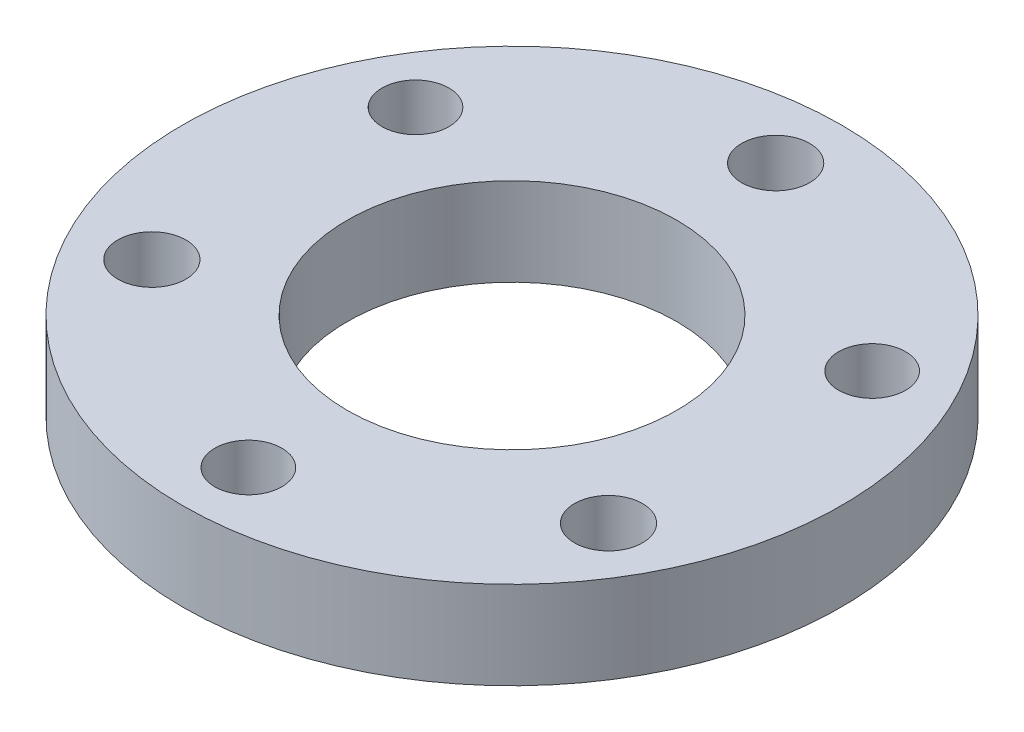
ISO-10303-21;
HEADER;
FILE_DESCRIPTION(('STEP AP214'),'2;1');
FILE_NAME('part.step','',(''),(''),'','','');
FILE_SCHEMA(('AUTOMOTIVE_DESIGN { 1 0 10303 214 1 1 1 1 }'));
ENDSEC;
DATA;
#1=APPLICATION_CONTEXT('core data for automotive mechanical design processes');
#2=APPLICATION_PROTOCOL_DEFINITION('international standard','automotive_design',2000,#1);
#3=PRODUCT_CONTEXT('',#1,'mechanical');
#4=PRODUCT('Part','Part','',(#3));
#5=PRODUCT_RELATED_PRODUCT_CATEGORY('part','',(#4));
#6=PRODUCT_DEFINITION_FORMATION('','',#4);
#7=PRODUCT_DEFINITION_CONTEXT('part definition',#1,'design');
#8=PRODUCT_DEFINITION('design','',#6,#7);
#9=PRODUCT_DEFINITION_SHAPE('','',#8);
#10=(LENGTH_UNIT() NAMED_UNIT(*) SI_UNIT(.MILLI.,.METRE.));
#11=(NAMED_UNIT(*) PLANE_ANGLE_UNIT() SI_UNIT($,.RADIAN.));
#12=(NAMED_UNIT(*) SI_UNIT($,.STERADIAN.) SOLID_ANGLE_UNIT());
#13=UNCERTAINTY_MEASURE_WITH_UNIT(LENGTH_MEASURE(1.E-05),#10,'distance_accuracy_value','');
#14=(GEOMETRIC_REPRESENTATION_CONTEXT(3) GLOBAL_UNCERTAINTY_ASSIGNED_CONTEXT((#13)) GLOBAL_UNIT_ASSIGNED_CONTEXT((#10,
#11,#12)) REPRESENTATION_CONTEXT('',''));
#15=CARTESIAN_POINT('',(0.,0.,0.));
#16=DIRECTION('',(0.,0.,1.));
#17=DIRECTION('',(1.,0.,0.));
#18=AXIS2_PLACEMENT_3D('',#15,#16,#17);
#19=CARTESIAN_POINT('',(0.,4.,0.));
#20=DIRECTION('',(0.,1.,0.));
#21=DIRECTION('',(0.,0.,1.));
#22=AXIS2_PLACEMENT_3D('',#19,#20,#21);
#23=PLANE('',#22);
#24=CARTESIAN_POINT('',(10.3923048454133,4.,-6.00000000000001));
#25=DIRECTION('',(0.,1.,0.));
#26=DIRECTION('',(0.,0.,1.));
#27=AXIS2_PLACEMENT_3D('',#24,#25,#26);
#28=CIRCLE('',#27,1.52499999999997);
#29=CARTESIAN_POINT('',(10.3923048454133,4.,-4.47500000000004));
#30=VERTEX_POINT('',#29);
#31=EDGE_CURVE('E79',#30,#30,#28,.T.);
#32=ORIENTED_EDGE('',*,*,#31,.F.);
#33=EDGE_LOOP('',(#32));
#34=FACE_BOUND('',#33,.T.);
#35=CARTESIAN_POINT('',(10.3923048454132,4.,6.00000000000005));
#36=DIRECTION('',(0.,1.,0.));
#37=DIRECTION('',(0.,0.,1.));
#38=AXIS2_PLACEMENT_3D('',#35,#36,#37);
#39=CIRCLE('',#38,1.55);
#40=CARTESIAN_POINT('',(10.3923048454132,4.,7.55000000000005));
#41=VERTEX_POINT('',#40);
#42=EDGE_CURVE('E67',#41,#41,#39,.T.);
#43=ORIENTED_EDGE('',*,*,#42,.F.);
#44=EDGE_LOOP('',(#43));
#45=FACE_BOUND('',#44,.T.);
#46=CARTESIAN_POINT('',(0.,4.,0.));
#47=DIRECTION('',(0.,1.,0.));
#48=DIRECTION('',(0.,0.,1.));
#49=AXIS2_PLACEMENT_3D('',#46,#47,#48);
#50=CIRCLE('',#49,7.5);
#51=CARTESIAN_POINT('',(0.,4.,7.5));
#52=VERTEX_POINT('',#51);
#53=EDGE_CURVE('E55',#52,#52,#50,.T.);
#54=ORIENTED_EDGE('',*,*,#53,.F.);
#55=EDGE_LOOP('',(#54));
#56=FACE_BOUND('',#55,.T.);
#57=CARTESIAN_POINT('',(0.,4.,0.));
#58=DIRECTION('',(0.,1.,0.));
#59=DIRECTION('',(0.,0.,1.));
#60=AXIS2_PLACEMENT_3D('',#57,#58,#59);
#61=CIRCLE('',#60,15.);
#62=CARTESIAN_POINT('',(0.,4.,15.));
#63=VERTEX_POINT('',#62);
#64=EDGE_CURVE('E10',#63,#63,#61,.T.);
#65=ORIENTED_EDGE('',*,*,#64,.T.);
#66=EDGE_LOOP('',(#65));
#67=FACE_BOUND('',#66,.T.);
#68=CARTESIAN_POINT('',(0.,4.,-12.));
#69=DIRECTION('',(0.,1.,0.));
#70=DIRECTION('',(0.,0.,1.));
#71=AXIS2_PLACEMENT_3D('',#68,#69,#70);
#72=CIRCLE('',#71,1.55);
#73=CARTESIAN_POINT('',(0.,4.,-10.45));
#74=VERTEX_POINT('',#73);
#75=EDGE_CURVE('E50',#74,#74,#72,.T.);
#76=ORIENTED_EDGE('',*,*,#75,.F.);
#77=EDGE_LOOP('',(#76));
#78=FACE_BOUND('',#77,.T.);
#79=CARTESIAN_POINT('',(-10.3923048454133,4.,-5.99999999999993));
#80=DIRECTION('',(0.,1.,0.));
#81=DIRECTION('',(0.,0.,1.));
#82=AXIS2_PLACEMENT_3D('',#79,#80,#81);
#83=CIRCLE('',#82,1.52499999999997);
#84=CARTESIAN_POINT('',(-10.3923048454133,4.,-4.47499999999996));
#85=VERTEX_POINT('',#84);
#86=EDGE_CURVE('E61',#85,#85,#83,.T.);
#87=ORIENTED_EDGE('',*,*,#86,.F.);
#88=EDGE_LOOP('',(#87));
#89=FACE_BOUND('',#88,.T.);
#90=CARTESIAN_POINT('',(-10.3923048454133,4.,5.99999999999991));
#91=DIRECTION('',(0.,1.,0.));
#92=DIRECTION('',(0.,0.,1.));
#93=AXIS2_PLACEMENT_3D('',#90,#91,#92);
#94=CIRCLE('',#93,1.55);
#95=CARTESIAN_POINT('',(-10.3923048454133,4.,7.54999999999991));
#96=VERTEX_POINT('',#95);
#97=EDGE_CURVE('E73',#96,#96,#94,.T.);
#98=ORIENTED_EDGE('',*,*,#97,.F.);
#99=EDGE_LOOP('',(#98));
#100=FACE_BOUND('',#99,.T.);
#101=CARTESIAN_POINT('',(0.,4.,12.));
#102=DIRECTION('',(0.,1.,0.));
#103=DIRECTION('',(0.,0.,1.));
#104=AXIS2_PLACEMENT_3D('',#101,#102,#103);
#105=CIRCLE('',#104,1.52499999999997);
#106=CARTESIAN_POINT('',(0.,4.,13.525));
#107=VERTEX_POINT('',#106);
#108=EDGE_CURVE('E85',#107,#107,#105,.T.);
#109=ORIENTED_EDGE('',*,*,#108,.F.);
#110=EDGE_LOOP('',(#109));
#111=FACE_BOUND('',#110,.T.);
#112=ADVANCED_FACE('F39',(#34,#45,#56,#67,#78,#89,#100,#111),#23,.T.);
#113=CARTESIAN_POINT('',(0.,0.,0.));
#114=DIRECTION('',(0.,1.,0.));
#115=DIRECTION('',(0.,0.,1.));
#116=AXIS2_PLACEMENT_3D('',#113,#114,#115);
#117=PLANE('',#116);
#118=CARTESIAN_POINT('',(0.,0.,0.));
#119=DIRECTION('',(0.,1.,0.));
#120=DIRECTION('',(0.,0.,1.));
#121=AXIS2_PLACEMENT_3D('',#118,#119,#120);
#122=CIRCLE('',#121,15.);
#123=CARTESIAN_POINT('',(0.,0.,15.));
#124=VERTEX_POINT('',#123);
#125=EDGE_CURVE('E43',#124,#124,#122,.T.);
#126=ORIENTED_EDGE('',*,*,#125,.F.);
#127=EDGE_LOOP('',(#126));
#128=FACE_BOUND('',#127,.T.);
#129=CARTESIAN_POINT('',(0.,0.,-12.));
#130=DIRECTION('',(0.,1.,0.));
#131=DIRECTION('',(0.,0.,1.));
#132=AXIS2_PLACEMENT_3D('',#129,#130,#131);
#133=CIRCLE('',#132,1.55);
#134=CARTESIAN_POINT('',(0.,0.,-10.45));
#135=VERTEX_POINT('',#134);
#136=EDGE_CURVE('E52',#135,#135,#133,.T.);
#137=ORIENTED_EDGE('',*,*,#136,.T.);
#138=EDGE_LOOP('',(#137));
#139=FACE_BOUND('',#138,.T.);
#140=CARTESIAN_POINT('',(0.,0.,0.));
#141=DIRECTION('',(0.,1.,0.));
#142=DIRECTION('',(0.,0.,1.));
#143=AXIS2_PLACEMENT_3D('',#140,#141,#142);
#144=CIRCLE('',#143,7.5);
#145=CARTESIAN_POINT('',(0.,0.,7.5));
#146=VERTEX_POINT('',#145);
#147=EDGE_CURVE('E58',#146,#146,#144,.T.);
#148=ORIENTED_EDGE('',*,*,#147,.T.);
#149=EDGE_LOOP('',(#148));
#150=FACE_BOUND('',#149,.T.);
#151=CARTESIAN_POINT('',(-10.3923048454133,0.,-5.99999999999993));
#152=DIRECTION('',(0.,1.,0.));
#153=DIRECTION('',(0.,0.,1.));
#154=AXIS2_PLACEMENT_3D('',#151,#152,#153);
#155=CIRCLE('',#154,1.52499999999997);
#156=CARTESIAN_POINT('',(-10.3923048454133,0.,-4.47499999999996));
#157=VERTEX_POINT('',#156);
#158=EDGE_CURVE('E64',#157,#157,#155,.T.);
#159=ORIENTED_EDGE('',*,*,#158,.T.);
#160=EDGE_LOOP('',(#159));
#161=FACE_BOUND('',#160,.T.);
#162=CARTESIAN_POINT('',(10.3923048454132,0.,6.00000000000005));
#163=DIRECTION('',(0.,1.,0.));
#164=DIRECTION('',(0.,0.,1.));
#165=AXIS2_PLACEMENT_3D('',#162,#163,#164);
#166=CIRCLE('',#165,1.55);
#167=CARTESIAN_POINT('',(10.3923048454132,0.,7.55000000000005));
#168=VERTEX_POINT('',#167);
#169=EDGE_CURVE('E70',#168,#168,#166,.T.);
#170=ORIENTED_EDGE('',*,*,#169,.T.);
#171=EDGE_LOOP('',(#170));
#172=FACE_BOUND('',#171,.T.);
#173=CARTESIAN_POINT('',(-10.3923048454133,0.,5.99999999999991));
#174=DIRECTION('',(0.,1.,0.));
#175=DIRECTION('',(0.,0.,1.));
#176=AXIS2_PLACEMENT_3D('',#173,#174,#175);
#177=CIRCLE('',#176,1.55);
#178=CARTESIAN_POINT('',(-10.3923048454133,0.,7.54999999999991));
#179=VERTEX_POINT('',#178);
#180=EDGE_CURVE('E76',#179,#179,#177,.T.);
#181=ORIENTED_EDGE('',*,*,#180,.T.);
#182=EDGE_LOOP('',(#181));
#183=FACE_BOUND('',#182,.T.);
#184=CARTESIAN_POINT('',(10.3923048454133,0.,-6.00000000000001));
#185=DIRECTION('',(0.,1.,0.));
#186=DIRECTION('',(0.,0.,1.));
#187=AXIS2_PLACEMENT_3D('',#184,#185,#186);
#188=CIRCLE('',#187,1.52499999999997);
#189=CARTESIAN_POINT('',(10.3923048454133,0.,-4.47500000000004));
#190=VERTEX_POINT('',#189);
#191=EDGE_CURVE('E82',#190,#190,#188,.T.);
#192=ORIENTED_EDGE('',*,*,#191,.T.);
#193=EDGE_LOOP('',(#192));
#194=FACE_BOUND('',#193,.T.);
#195=CARTESIAN_POINT('',(0.,0.,12.));
#196=DIRECTION('',(0.,1.,0.));
#197=DIRECTION('',(0.,0.,1.));
#198=AXIS2_PLACEMENT_3D('',#195,#196,#197);
#199=CIRCLE('',#198,1.52499999999997);
#200=CARTESIAN_POINT('',(0.,0.,13.525));
#201=VERTEX_POINT('',#200);
#202=EDGE_CURVE('E88',#201,#201,#199,.T.);
#203=ORIENTED_EDGE('',*,*,#202,.T.);
#204=EDGE_LOOP('',(#203));
#205=FACE_BOUND('',#204,.T.);
#206=ADVANCED_FACE('F98',(#128,#139,#150,#161,#172,#183,#194,#205),#117,.F.);
#207=CARTESIAN_POINT('',(0.,4.,0.));
#208=DIRECTION('',(0.,-1.,0.));
#209=DIRECTION('',(0.,0.,-1.));
#210=AXIS2_PLACEMENT_3D('',#207,#208,#209);
#211=CYLINDRICAL_SURFACE('',#210,15.);
#212=ORIENTED_EDGE('',*,*,#64,.F.);
#213=EDGE_LOOP('',(#212));
#214=FACE_BOUND('',#213,.T.);
#215=ORIENTED_EDGE('',*,*,#125,.T.);
#216=EDGE_LOOP('',(#215));
#217=FACE_BOUND('',#216,.T.);
#218=ADVANCED_FACE('F41',(#214,#217),#211,.T.);
#219=CARTESIAN_POINT('',(0.,4.,-12.));
#220=DIRECTION('',(0.,-1.,0.));
#221=DIRECTION('',(0.,0.,-1.));
#222=AXIS2_PLACEMENT_3D('',#219,#220,#221);
#223=CYLINDRICAL_SURFACE('',#222,1.55);
#224=ORIENTED_EDGE('',*,*,#75,.T.);
#225=EDGE_LOOP('',(#224));
#226=FACE_BOUND('',#225,.T.);
#227=ORIENTED_EDGE('',*,*,#136,.F.);
#228=EDGE_LOOP('',(#227));
#229=FACE_BOUND('',#228,.T.);
#230=ADVANCED_FACE('F108',(#226,#229),#223,.F.);
#231=CARTESIAN_POINT('',(0.,4.,0.));
#232=DIRECTION('',(0.,-1.,0.));
#233=DIRECTION('',(0.,0.,-1.));
#234=AXIS2_PLACEMENT_3D('',#231,#232,#233);
#235=CYLINDRICAL_SURFACE('',#234,7.5);
#236=ORIENTED_EDGE('',*,*,#53,.T.);
#237=EDGE_LOOP('',(#236));
#238=FACE_BOUND('',#237,.T.);
#239=ORIENTED_EDGE('',*,*,#147,.F.);
#240=EDGE_LOOP('',(#239));
#241=FACE_BOUND('',#240,.T.);
#242=ADVANCED_FACE('F111',(#238,#241),#235,.F.);
#243=CARTESIAN_POINT('',(-10.3923048454133,4.,-5.99999999999993));
#244=DIRECTION('',(0.,-1.,0.));
#245=DIRECTION('',(0.,0.,-1.));
#246=AXIS2_PLACEMENT_3D('',#243,#244,#245);
#247=CYLINDRICAL_SURFACE('',#246,1.52499999999997);
#248=ORIENTED_EDGE('',*,*,#86,.T.);
#249=EDGE_LOOP('',(#248));
#250=FACE_BOUND('',#249,.T.);
#251=ORIENTED_EDGE('',*,*,#158,.F.);
#252=EDGE_LOOP('',(#251));
#253=FACE_BOUND('',#252,.T.);
#254=ADVANCED_FACE('F115',(#250,#253),#247,.F.);
#255=CARTESIAN_POINT('',(10.3923048454132,4.,6.00000000000005));
#256=DIRECTION('',(0.,-1.,0.));
#257=DIRECTION('',(0.,0.,-1.));
#258=AXIS2_PLACEMENT_3D('',#255,#256,#257);
#259=CYLINDRICAL_SURFACE('',#258,1.55);
#260=ORIENTED_EDGE('',*,*,#42,.T.);
#261=EDGE_LOOP('',(#260));
#262=FACE_BOUND('',#261,.T.);
#263=ORIENTED_EDGE('',*,*,#169,.F.);
#264=EDGE_LOOP('',(#263));
#265=FACE_BOUND('',#264,.T.);
#266=ADVANCED_FACE('F119',(#262,#265),#259,.F.);
#267=CARTESIAN_POINT('',(-10.3923048454133,4.,5.99999999999991));
#268=DIRECTION('',(0.,-1.,0.));
#269=DIRECTION('',(0.,0.,-1.));
#270=AXIS2_PLACEMENT_3D('',#267,#268,#269);
#271=CYLINDRICAL_SURFACE('',#270,1.55);
#272=ORIENTED_EDGE('',*,*,#97,.T.);
#273=EDGE_LOOP('',(#272));
#274=FACE_BOUND('',#273,.T.);
#275=ORIENTED_EDGE('',*,*,#180,.F.);
#276=EDGE_LOOP('',(#275));
#277=FACE_BOUND('',#276,.T.);
#278=ADVANCED_FACE('F123',(#274,#277),#271,.F.);
#279=CARTESIAN_POINT('',(10.3923048454133,4.,-6.00000000000001));
#280=DIRECTION('',(0.,-1.,0.));
#281=DIRECTION('',(0.,0.,-1.));
#282=AXIS2_PLACEMENT_3D('',#279,#280,#281);
#283=CYLINDRICAL_SURFACE('',#282,1.52499999999997);
#284=ORIENTED_EDGE('',*,*,#31,.T.);
#285=EDGE_LOOP('',(#284));
#286=FACE_BOUND('',#285,.T.);
#287=ORIENTED_EDGE('',*,*,#191,.F.);
#288=EDGE_LOOP('',(#287));
#289=FACE_BOUND('',#288,.T.);
#290=ADVANCED_FACE('F127',(#286,#289),#283,.F.);
#291=CARTESIAN_POINT('',(0.,4.,12.));
#292=DIRECTION('',(0.,-1.,0.));
#293=DIRECTION('',(0.,0.,-1.));
#294=AXIS2_PLACEMENT_3D('',#291,#292,#293);
#295=CYLINDRICAL_SURFACE('',#294,1.52499999999997);
#296=ORIENTED_EDGE('',*,*,#108,.T.);
#297=EDGE_LOOP('',(#296));
#298=FACE_BOUND('',#297,.T.);
#299=ORIENTED_EDGE('',*,*,#202,.F.);
#300=EDGE_LOOP('',(#299));
#301=FACE_BOUND('',#300,.T.);
#302=ADVANCED_FACE('F94',(#298,#301),#295,.F.);
#303=CLOSED_SHELL('',(#112,#206,#218,#230,#242,#254,#266,#278,#290,#302));
#304=MANIFOLD_SOLID_BREP('B2',#303);
#305=ADVANCED_BREP_SHAPE_REPRESENTATION('',(#18,#304),#14);
#306=SHAPE_DEFINITION_REPRESENTATION(#9,#305);
ENDSEC;
END-ISO-10303-21;
